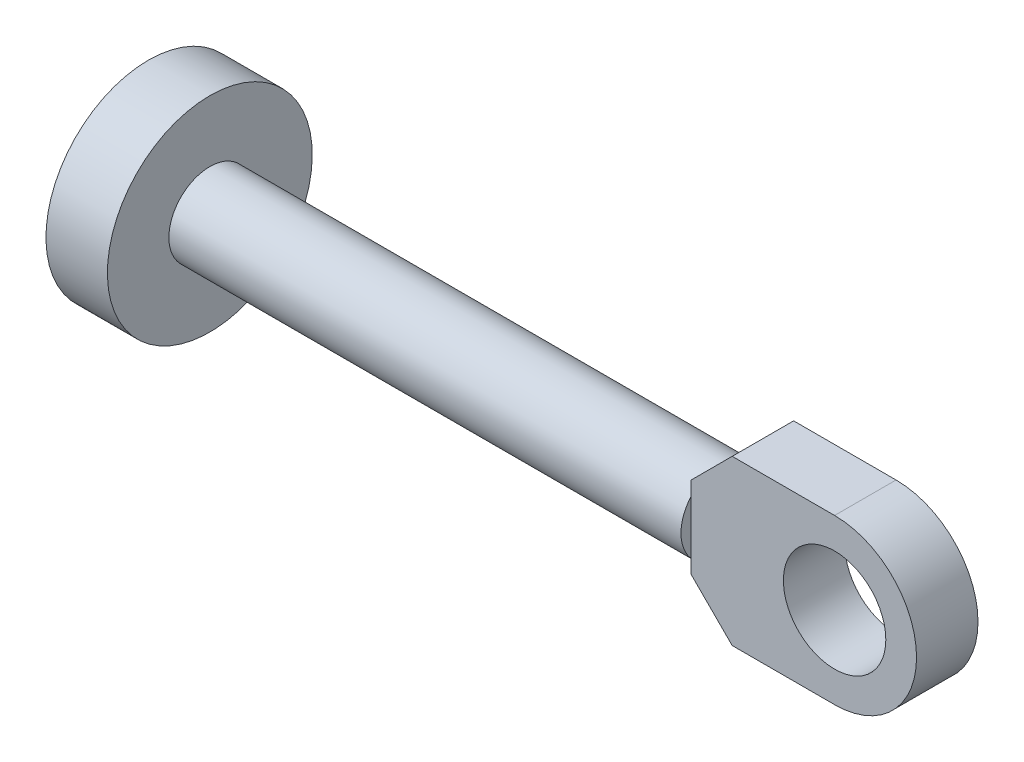
ISO-10303-21;
HEADER;
FILE_DESCRIPTION(('STEP AP214'),'2;1');
FILE_NAME('part.step','',(''),(''),'','','');
FILE_SCHEMA(('AUTOMOTIVE_DESIGN { 1 0 10303 214 1 1 1 1 }'));
ENDSEC;
DATA;
#1=APPLICATION_CONTEXT('core data for automotive mechanical design processes');
#2=APPLICATION_PROTOCOL_DEFINITION('international standard','automotive_design',2000,#1);
#3=PRODUCT_CONTEXT('',#1,'mechanical');
#4=PRODUCT('Part','Part','',(#3));
#5=PRODUCT_RELATED_PRODUCT_CATEGORY('part','',(#4));
#6=PRODUCT_DEFINITION_FORMATION('','',#4);
#7=PRODUCT_DEFINITION_CONTEXT('part definition',#1,'design');
#8=PRODUCT_DEFINITION('design','',#6,#7);
#9=PRODUCT_DEFINITION_SHAPE('','',#8);
#10=(LENGTH_UNIT() NAMED_UNIT(*) SI_UNIT(.MILLI.,.METRE.));
#11=(NAMED_UNIT(*) PLANE_ANGLE_UNIT() SI_UNIT($,.RADIAN.));
#12=(NAMED_UNIT(*) SI_UNIT($,.STERADIAN.) SOLID_ANGLE_UNIT());
#13=UNCERTAINTY_MEASURE_WITH_UNIT(LENGTH_MEASURE(1.E-05),#10,'distance_accuracy_value','');
#14=(GEOMETRIC_REPRESENTATION_CONTEXT(3) GLOBAL_UNCERTAINTY_ASSIGNED_CONTEXT((#13)) GLOBAL_UNIT_ASSIGNED_CONTEXT((#10,
#11,#12)) REPRESENTATION_CONTEXT('',''));
#15=CARTESIAN_POINT('',(0.,0.,0.));
#16=DIRECTION('',(0.,0.,1.));
#17=DIRECTION('',(1.,0.,0.));
#18=AXIS2_PLACEMENT_3D('',#15,#16,#17);
#19=CARTESIAN_POINT('',(0.,2.5,0.));
#20=DIRECTION('',(-1.,0.,0.));
#21=DIRECTION('',(0.,0.,1.));
#22=AXIS2_PLACEMENT_3D('',#19,#20,#21);
#23=PLANE('',#22);
#24=CARTESIAN_POINT('',(0.,0.,0.));
#25=DIRECTION('',(1.,0.,0.));
#26=DIRECTION('',(0.,1.,0.));
#27=AXIS2_PLACEMENT_3D('',#24,#25,#26);
#28=CIRCLE('',#27,5.);
#29=CARTESIAN_POINT('',(0.,5.,0.));
#30=VERTEX_POINT('',#29);
#31=EDGE_CURVE('E260',#30,#30,#28,.T.);
#32=ORIENTED_EDGE('',*,*,#31,.F.);
#33=EDGE_LOOP('',(#32));
#34=FACE_BOUND('',#33,.T.);
#35=ADVANCED_FACE('F16',(#34),#23,.T.);
#36=CARTESIAN_POINT('',(28.,1.,0.));
#37=DIRECTION('',(1.,0.,0.));
#38=DIRECTION('',(0.,1.,0.));
#39=AXIS2_PLACEMENT_3D('',#36,#37,#38);
#40=PLANE('',#39);
#41=DIRECTION('',(0.,-1.,0.));
#42=VECTOR('',#41,1.);
#43=CARTESIAN_POINT('',(28.,1.3228756555323,-1.5));
#44=LINE('',#43,#42);
#45=CARTESIAN_POINT('',(28.,1.3228756555323,-1.5));
#46=VERTEX_POINT('',#45);
#47=CARTESIAN_POINT('',(28.,-1.32287565553229,-1.5));
#48=VERTEX_POINT('',#47);
#49=EDGE_CURVE('E168',#46,#48,#44,.T.);
#50=ORIENTED_EDGE('',*,*,#49,.T.);
#51=CARTESIAN_POINT('',(28.,0.,0.));
#52=DIRECTION('',(1.,0.,0.));
#53=DIRECTION('',(0.,1.,0.));
#54=AXIS2_PLACEMENT_3D('',#51,#52,#53);
#55=CIRCLE('',#54,2.);
#56=EDGE_CURVE('E10',#48,#46,#55,.T.);
#57=ORIENTED_EDGE('',*,*,#56,.T.);
#58=EDGE_LOOP('',(#50,#57));
#59=FACE_BOUND('',#58,.T.);
#60=ADVANCED_FACE('F317',(#59),#40,.T.);
#61=CARTESIAN_POINT('',(15.5,0.,0.));
#62=DIRECTION('',(1.,0.,0.));
#63=DIRECTION('',(0.,1.,0.));
#64=AXIS2_PLACEMENT_3D('',#61,#62,#63);
#65=CYLINDRICAL_SURFACE('',#64,2.);
#66=CARTESIAN_POINT('',(3.,0.,0.));
#67=DIRECTION('',(1.,0.,0.));
#68=DIRECTION('',(0.,1.,0.));
#69=AXIS2_PLACEMENT_3D('',#66,#67,#68);
#70=CIRCLE('',#69,2.);
#71=CARTESIAN_POINT('',(3.,2.,0.));
#72=VERTEX_POINT('',#71);
#73=EDGE_CURVE('E27',#72,#72,#70,.T.);
#74=ORIENTED_EDGE('',*,*,#73,.T.);
#75=EDGE_LOOP('',(#74));
#76=FACE_BOUND('',#75,.T.);
#77=CARTESIAN_POINT('',(28.,0.,0.));
#78=DIRECTION('',(1.,0.,0.));
#79=DIRECTION('',(0.,1.,0.));
#80=AXIS2_PLACEMENT_3D('',#77,#78,#79);
#81=CIRCLE('',#80,2.);
#82=CARTESIAN_POINT('',(28.,2.,0.));
#83=VERTEX_POINT('',#82);
#84=EDGE_CURVE('E174',#46,#83,#81,.T.);
#85=ORIENTED_EDGE('',*,*,#84,.F.);
#86=ORIENTED_EDGE('',*,*,#56,.F.);
#87=CARTESIAN_POINT('',(28.,0.,0.));
#88=DIRECTION('',(1.,0.,0.));
#89=DIRECTION('',(0.,1.,0.));
#90=AXIS2_PLACEMENT_3D('',#87,#88,#89);
#91=CIRCLE('',#90,2.);
#92=CARTESIAN_POINT('',(28.,-2.,0.));
#93=VERTEX_POINT('',#92);
#94=EDGE_CURVE('E186',#93,#48,#91,.T.);
#95=ORIENTED_EDGE('',*,*,#94,.F.);
#96=CARTESIAN_POINT('',(28.,0.,0.));
#97=DIRECTION('',(1.,0.,0.));
#98=DIRECTION('',(0.,1.,0.));
#99=AXIS2_PLACEMENT_3D('',#96,#97,#98);
#100=CIRCLE('',#99,2.);
#101=CARTESIAN_POINT('',(28.,-1.32287565553229,1.5));
#102=VERTEX_POINT('',#101);
#103=EDGE_CURVE('E189',#102,#93,#100,.T.);
#104=ORIENTED_EDGE('',*,*,#103,.F.);
#105=CARTESIAN_POINT('',(28.,0.,0.));
#106=DIRECTION('',(1.,0.,0.));
#107=DIRECTION('',(0.,1.,0.));
#108=AXIS2_PLACEMENT_3D('',#105,#106,#107);
#109=CIRCLE('',#108,2.);
#110=CARTESIAN_POINT('',(28.,1.3228756555323,1.5));
#111=VERTEX_POINT('',#110);
#112=EDGE_CURVE('E198',#111,#102,#109,.T.);
#113=ORIENTED_EDGE('',*,*,#112,.F.);
#114=CARTESIAN_POINT('',(28.,0.,0.));
#115=DIRECTION('',(1.,0.,0.));
#116=DIRECTION('',(0.,1.,0.));
#117=AXIS2_PLACEMENT_3D('',#114,#115,#116);
#118=CIRCLE('',#117,2.);
#119=EDGE_CURVE('E170',#83,#111,#118,.T.);
#120=ORIENTED_EDGE('',*,*,#119,.F.);
#121=EDGE_LOOP('',(#85,#86,#95,#104,#113,#120));
#122=FACE_BOUND('',#121,.T.);
#123=ADVANCED_FACE('F312',(#76,#122),#65,.T.);
#124=CARTESIAN_POINT('',(3.,3.5,0.));
#125=DIRECTION('',(1.,0.,0.));
#126=DIRECTION('',(0.,1.,0.));
#127=AXIS2_PLACEMENT_3D('',#124,#125,#126);
#128=PLANE('',#127);
#129=ORIENTED_EDGE('',*,*,#73,.F.);
#130=EDGE_LOOP('',(#129));
#131=FACE_BOUND('',#130,.T.);
#132=CARTESIAN_POINT('',(3.,0.,0.));
#133=DIRECTION('',(1.,0.,0.));
#134=DIRECTION('',(0.,1.,0.));
#135=AXIS2_PLACEMENT_3D('',#132,#133,#134);
#136=CIRCLE('',#135,5.);
#137=CARTESIAN_POINT('',(3.,5.,0.));
#138=VERTEX_POINT('',#137);
#139=EDGE_CURVE('E252',#138,#138,#136,.T.);
#140=ORIENTED_EDGE('',*,*,#139,.T.);
#141=EDGE_LOOP('',(#140));
#142=FACE_BOUND('',#141,.T.);
#143=ADVANCED_FACE('F299',(#131,#142),#128,.T.);
#144=CARTESIAN_POINT('',(1.5,0.,0.));
#145=DIRECTION('',(1.,0.,0.));
#146=DIRECTION('',(0.,1.,0.));
#147=AXIS2_PLACEMENT_3D('',#144,#145,#146);
#148=CYLINDRICAL_SURFACE('',#147,5.);
#149=ORIENTED_EDGE('',*,*,#31,.T.);
#150=EDGE_LOOP('',(#149));
#151=FACE_BOUND('',#150,.T.);
#152=ORIENTED_EDGE('',*,*,#139,.F.);
#153=EDGE_LOOP('',(#152));
#154=FACE_BOUND('',#153,.T.);
#155=ADVANCED_FACE('F301',(#151,#154),#148,.T.);
#156=CARTESIAN_POINT('',(28.,1.,0.));
#157=DIRECTION('',(1.,0.,0.));
#158=DIRECTION('',(0.,1.,0.));
#159=AXIS2_PLACEMENT_3D('',#156,#157,#158);
#160=PLANE('',#159);
#161=DIRECTION('',(0.,1.,0.));
#162=VECTOR('',#161,1.);
#163=CARTESIAN_POINT('',(28.,-1.32287565553229,1.5));
#164=LINE('',#163,#162);
#165=EDGE_CURVE('E183',#102,#111,#164,.T.);
#166=ORIENTED_EDGE('',*,*,#165,.T.);
#167=ORIENTED_EDGE('',*,*,#112,.T.);
#168=EDGE_LOOP('',(#166,#167));
#169=FACE_BOUND('',#168,.T.);
#170=ADVANCED_FACE('F303',(#169),#160,.T.);
#171=CARTESIAN_POINT('',(28.,-4.,0.));
#172=DIRECTION('',(-1.,0.,0.));
#173=DIRECTION('',(0.,0.,1.));
#174=AXIS2_PLACEMENT_3D('',#171,#172,#173);
#175=PLANE('',#174);
#176=DIRECTION('',(0.,0.,-1.));
#177=VECTOR('',#176,1.);
#178=CARTESIAN_POINT('',(28.,-2.,1.5));
#179=LINE('',#178,#177);
#180=CARTESIAN_POINT('',(28.,-2.,1.5));
#181=VERTEX_POINT('',#180);
#182=EDGE_CURVE('E151',#181,#93,#179,.T.);
#183=ORIENTED_EDGE('',*,*,#182,.F.);
#184=DIRECTION('',(0.,1.,0.));
#185=VECTOR('',#184,1.);
#186=CARTESIAN_POINT('',(28.,-2.,1.5));
#187=LINE('',#186,#185);
#188=EDGE_CURVE('E148',#181,#102,#187,.T.);
#189=ORIENTED_EDGE('',*,*,#188,.T.);
#190=ORIENTED_EDGE('',*,*,#103,.T.);
#191=EDGE_LOOP('',(#183,#189,#190));
#192=FACE_BOUND('',#191,.T.);
#193=ADVANCED_FACE('F310',(#192),#175,.T.);
#194=CARTESIAN_POINT('',(35.,0.,0.));
#195=DIRECTION('',(0.,0.,1.));
#196=DIRECTION('',(-1.,0.,0.));
#197=AXIS2_PLACEMENT_3D('',#194,#195,#196);
#198=CYLINDRICAL_SURFACE('',#197,2.5);
#199=CARTESIAN_POINT('',(35.,0.,1.5));
#200=DIRECTION('',(0.,0.,-1.));
#201=DIRECTION('',(-1.,0.,0.));
#202=AXIS2_PLACEMENT_3D('',#199,#200,#201);
#203=CIRCLE('',#202,2.5);
#204=CARTESIAN_POINT('',(37.5,0.,1.5));
#205=VERTEX_POINT('',#204);
#206=EDGE_CURVE('E73',#205,#205,#203,.T.);
#207=ORIENTED_EDGE('',*,*,#206,.F.);
#208=EDGE_LOOP('',(#207));
#209=FACE_BOUND('',#208,.T.);
#210=CARTESIAN_POINT('',(35.,0.,-1.5));
#211=DIRECTION('',(0.,0.,1.));
#212=DIRECTION('',(-1.,0.,0.));
#213=AXIS2_PLACEMENT_3D('',#210,#211,#212);
#214=CIRCLE('',#213,2.5);
#215=CARTESIAN_POINT('',(37.5,0.,-1.5));
#216=VERTEX_POINT('',#215);
#217=EDGE_CURVE('E193',#216,#216,#214,.T.);
#218=ORIENTED_EDGE('',*,*,#217,.F.);
#219=EDGE_LOOP('',(#218));
#220=FACE_BOUND('',#219,.T.);
#221=ADVANCED_FACE('F18',(#209,#220),#198,.F.);
#222=CARTESIAN_POINT('',(28.,-4.,0.));
#223=DIRECTION('',(-1.,0.,0.));
#224=DIRECTION('',(0.,0.,1.));
#225=AXIS2_PLACEMENT_3D('',#222,#223,#224);
#226=PLANE('',#225);
#227=DIRECTION('',(0.,0.,1.));
#228=VECTOR('',#227,1.);
#229=CARTESIAN_POINT('',(28.,2.,-1.5));
#230=LINE('',#229,#228);
#231=CARTESIAN_POINT('',(28.,2.,-1.5));
#232=VERTEX_POINT('',#231);
#233=EDGE_CURVE('E180',#232,#83,#230,.T.);
#234=ORIENTED_EDGE('',*,*,#233,.F.);
#235=DIRECTION('',(0.,-1.,0.));
#236=VECTOR('',#235,1.);
#237=CARTESIAN_POINT('',(28.,2.,-1.5));
#238=LINE('',#237,#236);
#239=EDGE_CURVE('E164',#232,#46,#238,.T.);
#240=ORIENTED_EDGE('',*,*,#239,.T.);
#241=ORIENTED_EDGE('',*,*,#84,.T.);
#242=EDGE_LOOP('',(#234,#240,#241));
#243=FACE_BOUND('',#242,.T.);
#244=ADVANCED_FACE('F355',(#243),#226,.T.);
#245=CARTESIAN_POINT('',(35.,0.,0.));
#246=DIRECTION('',(0.,0.,1.));
#247=DIRECTION('',(0.707106781186547,0.707106781186548,0.));
#248=AXIS2_PLACEMENT_3D('',#245,#246,#247);
#249=CYLINDRICAL_SURFACE('',#248,4.);
#250=CARTESIAN_POINT('',(35.,0.,1.5));
#251=DIRECTION('',(0.,0.,-1.));
#252=DIRECTION('',(0.707106781186547,-0.707106781186548,0.));
#253=AXIS2_PLACEMENT_3D('',#250,#251,#252);
#254=CIRCLE('',#253,4.);
#255=CARTESIAN_POINT('',(35.,4.,1.5));
#256=VERTEX_POINT('',#255);
#257=CARTESIAN_POINT('',(35.,-4.,1.5));
#258=VERTEX_POINT('',#257);
#259=EDGE_CURVE('E133',#256,#258,#254,.T.);
#260=ORIENTED_EDGE('',*,*,#259,.T.);
#261=DIRECTION('',(0.,0.,-1.));
#262=VECTOR('',#261,1.);
#263=CARTESIAN_POINT('',(35.,-4.,1.5));
#264=LINE('',#263,#262);
#265=CARTESIAN_POINT('',(35.,-4.,-1.5));
#266=VERTEX_POINT('',#265);
#267=EDGE_CURVE('E127',#258,#266,#264,.T.);
#268=ORIENTED_EDGE('',*,*,#267,.T.);
#269=CARTESIAN_POINT('',(35.,0.,-1.5));
#270=DIRECTION('',(0.,0.,1.));
#271=DIRECTION('',(0.707106781186547,0.707106781186548,0.));
#272=AXIS2_PLACEMENT_3D('',#269,#270,#271);
#273=CIRCLE('',#272,4.);
#274=CARTESIAN_POINT('',(35.,4.,-1.5));
#275=VERTEX_POINT('',#274);
#276=EDGE_CURVE('E58',#266,#275,#273,.T.);
#277=ORIENTED_EDGE('',*,*,#276,.T.);
#278=DIRECTION('',(0.,0.,1.));
#279=VECTOR('',#278,1.);
#280=CARTESIAN_POINT('',(35.,4.,-1.5));
#281=LINE('',#280,#279);
#282=EDGE_CURVE('E175',#275,#256,#281,.T.);
#283=ORIENTED_EDGE('',*,*,#282,.T.);
#284=EDGE_LOOP('',(#260,#268,#277,#283));
#285=FACE_BOUND('',#284,.T.);
#286=ADVANCED_FACE('F326',(#285),#249,.T.);
#287=CARTESIAN_POINT('',(28.,-4.,0.));
#288=DIRECTION('',(-1.,0.,0.));
#289=DIRECTION('',(0.,0.,1.));
#290=AXIS2_PLACEMENT_3D('',#287,#288,#289);
#291=PLANE('',#290);
#292=DIRECTION('',(0.,0.,1.));
#293=VECTOR('',#292,1.);
#294=CARTESIAN_POINT('',(28.,2.,0.));
#295=LINE('',#294,#293);
#296=CARTESIAN_POINT('',(28.,2.,1.5));
#297=VERTEX_POINT('',#296);
#298=EDGE_CURVE('E176',#83,#297,#295,.T.);
#299=ORIENTED_EDGE('',*,*,#298,.F.);
#300=ORIENTED_EDGE('',*,*,#119,.T.);
#301=DIRECTION('',(0.,1.,0.));
#302=VECTOR('',#301,1.);
#303=CARTESIAN_POINT('',(28.,1.3228756555323,1.5));
#304=LINE('',#303,#302);
#305=EDGE_CURVE('E231',#111,#297,#304,.T.);
#306=ORIENTED_EDGE('',*,*,#305,.T.);
#307=EDGE_LOOP('',(#299,#300,#306));
#308=FACE_BOUND('',#307,.T.);
#309=ADVANCED_FACE('F334',(#308),#291,.T.);
#310=CARTESIAN_POINT('',(28.,4.,0.));
#311=DIRECTION('',(0.,1.,0.));
#312=DIRECTION('',(1.,0.,0.));
#313=AXIS2_PLACEMENT_3D('',#310,#311,#312);
#314=PLANE('',#313);
#315=DIRECTION('',(0.,0.,-1.));
#316=VECTOR('',#315,1.);
#317=CARTESIAN_POINT('',(30.,4.,1.5));
#318=LINE('',#317,#316);
#319=CARTESIAN_POINT('',(30.,4.,1.5));
#320=VERTEX_POINT('',#319);
#321=CARTESIAN_POINT('',(30.,4.,-1.5));
#322=VERTEX_POINT('',#321);
#323=EDGE_CURVE('E196',#320,#322,#318,.T.);
#324=ORIENTED_EDGE('',*,*,#323,.F.);
#325=DIRECTION('',(1.,0.,0.));
#326=VECTOR('',#325,1.);
#327=CARTESIAN_POINT('',(30.,4.,1.5));
#328=LINE('',#327,#326);
#329=EDGE_CURVE('E278',#320,#256,#328,.T.);
#330=ORIENTED_EDGE('',*,*,#329,.T.);
#331=ORIENTED_EDGE('',*,*,#282,.F.);
#332=DIRECTION('',(-1.,0.,0.));
#333=VECTOR('',#332,1.);
#334=CARTESIAN_POINT('',(35.,4.,-1.5));
#335=LINE('',#334,#333);
#336=EDGE_CURVE('E199',#275,#322,#335,.T.);
#337=ORIENTED_EDGE('',*,*,#336,.T.);
#338=EDGE_LOOP('',(#324,#330,#331,#337));
#339=FACE_BOUND('',#338,.T.);
#340=ADVANCED_FACE('F337',(#339),#314,.T.);
#341=CARTESIAN_POINT('',(29.,3.,0.));
#342=DIRECTION('',(-0.707106781186547,0.707106781186548,0.));
#343=DIRECTION('',(0.,0.,1.));
#344=AXIS2_PLACEMENT_3D('',#341,#342,#343);
#345=PLANE('',#344);
#346=DIRECTION('',(0.707106781186548,0.707106781186547,0.));
#347=VECTOR('',#346,1.);
#348=CARTESIAN_POINT('',(28.,2.,1.5));
#349=LINE('',#348,#347);
#350=EDGE_CURVE('E20',#297,#320,#349,.T.);
#351=ORIENTED_EDGE('',*,*,#350,.T.);
#352=ORIENTED_EDGE('',*,*,#323,.T.);
#353=DIRECTION('',(-0.707106781186548,-0.707106781186547,0.));
#354=VECTOR('',#353,1.);
#355=CARTESIAN_POINT('',(30.,4.,-1.5));
#356=LINE('',#355,#354);
#357=EDGE_CURVE('E167',#322,#232,#356,.T.);
#358=ORIENTED_EDGE('',*,*,#357,.T.);
#359=ORIENTED_EDGE('',*,*,#233,.T.);
#360=ORIENTED_EDGE('',*,*,#298,.T.);
#361=EDGE_LOOP('',(#351,#352,#358,#359,#360));
#362=FACE_BOUND('',#361,.T.);
#363=ADVANCED_FACE('F338',(#362),#345,.T.);
#364=CARTESIAN_POINT('',(33.5,0.,-1.5));
#365=DIRECTION('',(0.,0.,1.));
#366=DIRECTION('',(1.,0.,0.));
#367=AXIS2_PLACEMENT_3D('',#364,#365,#366);
#368=PLANE('',#367);
#369=ORIENTED_EDGE('',*,*,#217,.T.);
#370=EDGE_LOOP('',(#369));
#371=FACE_BOUND('',#370,.T.);
#372=DIRECTION('',(0.707106781186548,-0.707106781186547,0.));
#373=VECTOR('',#372,1.);
#374=CARTESIAN_POINT('',(28.,-2.,-1.5));
#375=LINE('',#374,#373);
#376=CARTESIAN_POINT('',(28.,-2.,-1.5));
#377=VERTEX_POINT('',#376);
#378=CARTESIAN_POINT('',(30.,-4.,-1.5));
#379=VERTEX_POINT('',#378);
#380=EDGE_CURVE('E142',#377,#379,#375,.T.);
#381=ORIENTED_EDGE('',*,*,#380,.F.);
#382=DIRECTION('',(0.,-1.,0.));
#383=VECTOR('',#382,1.);
#384=CARTESIAN_POINT('',(28.,-1.32287565553229,-1.5));
#385=LINE('',#384,#383);
#386=EDGE_CURVE('E220',#48,#377,#385,.T.);
#387=ORIENTED_EDGE('',*,*,#386,.F.);
#388=ORIENTED_EDGE('',*,*,#49,.F.);
#389=ORIENTED_EDGE('',*,*,#239,.F.);
#390=ORIENTED_EDGE('',*,*,#357,.F.);
#391=ORIENTED_EDGE('',*,*,#336,.F.);
#392=ORIENTED_EDGE('',*,*,#276,.F.);
#393=DIRECTION('',(1.,0.,0.));
#394=VECTOR('',#393,1.);
#395=CARTESIAN_POINT('',(30.,-4.,-1.5));
#396=LINE('',#395,#394);
#397=EDGE_CURVE('E187',#379,#266,#396,.T.);
#398=ORIENTED_EDGE('',*,*,#397,.F.);
#399=EDGE_LOOP('',(#381,#387,#388,#389,#390,#391,#392,#398));
#400=FACE_BOUND('',#399,.T.);
#401=ADVANCED_FACE('F333',(#371,#400),#368,.F.);
#402=CARTESIAN_POINT('',(28.,-4.,0.));
#403=DIRECTION('',(-1.,0.,0.));
#404=DIRECTION('',(0.,0.,1.));
#405=AXIS2_PLACEMENT_3D('',#402,#403,#404);
#406=PLANE('',#405);
#407=DIRECTION('',(0.,0.,-1.));
#408=VECTOR('',#407,1.);
#409=CARTESIAN_POINT('',(28.,-2.,0.));
#410=LINE('',#409,#408);
#411=EDGE_CURVE('E157',#93,#377,#410,.T.);
#412=ORIENTED_EDGE('',*,*,#411,.F.);
#413=ORIENTED_EDGE('',*,*,#94,.T.);
#414=ORIENTED_EDGE('',*,*,#386,.T.);
#415=EDGE_LOOP('',(#412,#413,#414));
#416=FACE_BOUND('',#415,.T.);
#417=ADVANCED_FACE('F330',(#416),#406,.T.);
#418=CARTESIAN_POINT('',(39.,-4.,0.));
#419=DIRECTION('',(0.,-1.,0.));
#420=DIRECTION('',(0.,0.,-1.));
#421=AXIS2_PLACEMENT_3D('',#418,#419,#420);
#422=PLANE('',#421);
#423=DIRECTION('',(0.,0.,1.));
#424=VECTOR('',#423,1.);
#425=CARTESIAN_POINT('',(30.,-4.,-1.5));
#426=LINE('',#425,#424);
#427=CARTESIAN_POINT('',(30.,-4.,1.5));
#428=VERTEX_POINT('',#427);
#429=EDGE_CURVE('E125',#379,#428,#426,.T.);
#430=ORIENTED_EDGE('',*,*,#429,.F.);
#431=ORIENTED_EDGE('',*,*,#397,.T.);
#432=ORIENTED_EDGE('',*,*,#267,.F.);
#433=DIRECTION('',(-1.,0.,0.));
#434=VECTOR('',#433,1.);
#435=CARTESIAN_POINT('',(35.,-4.,1.5));
#436=LINE('',#435,#434);
#437=EDGE_CURVE('E121',#258,#428,#436,.T.);
#438=ORIENTED_EDGE('',*,*,#437,.T.);
#439=EDGE_LOOP('',(#430,#431,#432,#438));
#440=FACE_BOUND('',#439,.T.);
#441=ADVANCED_FACE('F123',(#440),#422,.T.);
#442=CARTESIAN_POINT('',(33.5,0.,1.5));
#443=DIRECTION('',(0.,0.,1.));
#444=DIRECTION('',(1.,0.,0.));
#445=AXIS2_PLACEMENT_3D('',#442,#443,#444);
#446=PLANE('',#445);
#447=ORIENTED_EDGE('',*,*,#206,.T.);
#448=EDGE_LOOP('',(#447));
#449=FACE_BOUND('',#448,.T.);
#450=DIRECTION('',(-0.707106781186548,0.707106781186547,0.));
#451=VECTOR('',#450,1.);
#452=CARTESIAN_POINT('',(30.,-4.,1.5));
#453=LINE('',#452,#451);
#454=EDGE_CURVE('E139',#428,#181,#453,.T.);
#455=ORIENTED_EDGE('',*,*,#454,.F.);
#456=ORIENTED_EDGE('',*,*,#437,.F.);
#457=ORIENTED_EDGE('',*,*,#259,.F.);
#458=ORIENTED_EDGE('',*,*,#329,.F.);
#459=ORIENTED_EDGE('',*,*,#350,.F.);
#460=ORIENTED_EDGE('',*,*,#305,.F.);
#461=ORIENTED_EDGE('',*,*,#165,.F.);
#462=ORIENTED_EDGE('',*,*,#188,.F.);
#463=EDGE_LOOP('',(#455,#456,#457,#458,#459,#460,#461,#462));
#464=FACE_BOUND('',#463,.T.);
#465=ADVANCED_FACE('F145',(#449,#464),#446,.T.);
#466=CARTESIAN_POINT('',(29.,-3.,0.));
#467=DIRECTION('',(-0.707106781186547,-0.707106781186548,0.));
#468=DIRECTION('',(-0.707106781186548,0.707106781186547,0.));
#469=AXIS2_PLACEMENT_3D('',#466,#467,#468);
#470=PLANE('',#469);
#471=ORIENTED_EDGE('',*,*,#454,.T.);
#472=ORIENTED_EDGE('',*,*,#182,.T.);
#473=ORIENTED_EDGE('',*,*,#411,.T.);
#474=ORIENTED_EDGE('',*,*,#380,.T.);
#475=ORIENTED_EDGE('',*,*,#429,.T.);
#476=EDGE_LOOP('',(#471,#472,#473,#474,#475));
#477=FACE_BOUND('',#476,.T.);
#478=ADVANCED_FACE('F137',(#477),#470,.T.);
#479=CLOSED_SHELL('',(#35,#60,#123,#143,#155,#170,#193,#221,#244,#286,#309,#340,#363,#401,#417,
#441,#465,#478));
#480=MANIFOLD_SOLID_BREP('B1',#479);
#481=ADVANCED_BREP_SHAPE_REPRESENTATION('',(#18,#480),#14);
#482=SHAPE_DEFINITION_REPRESENTATION(#9,#481);
ENDSEC;
END-ISO-10303-21;
